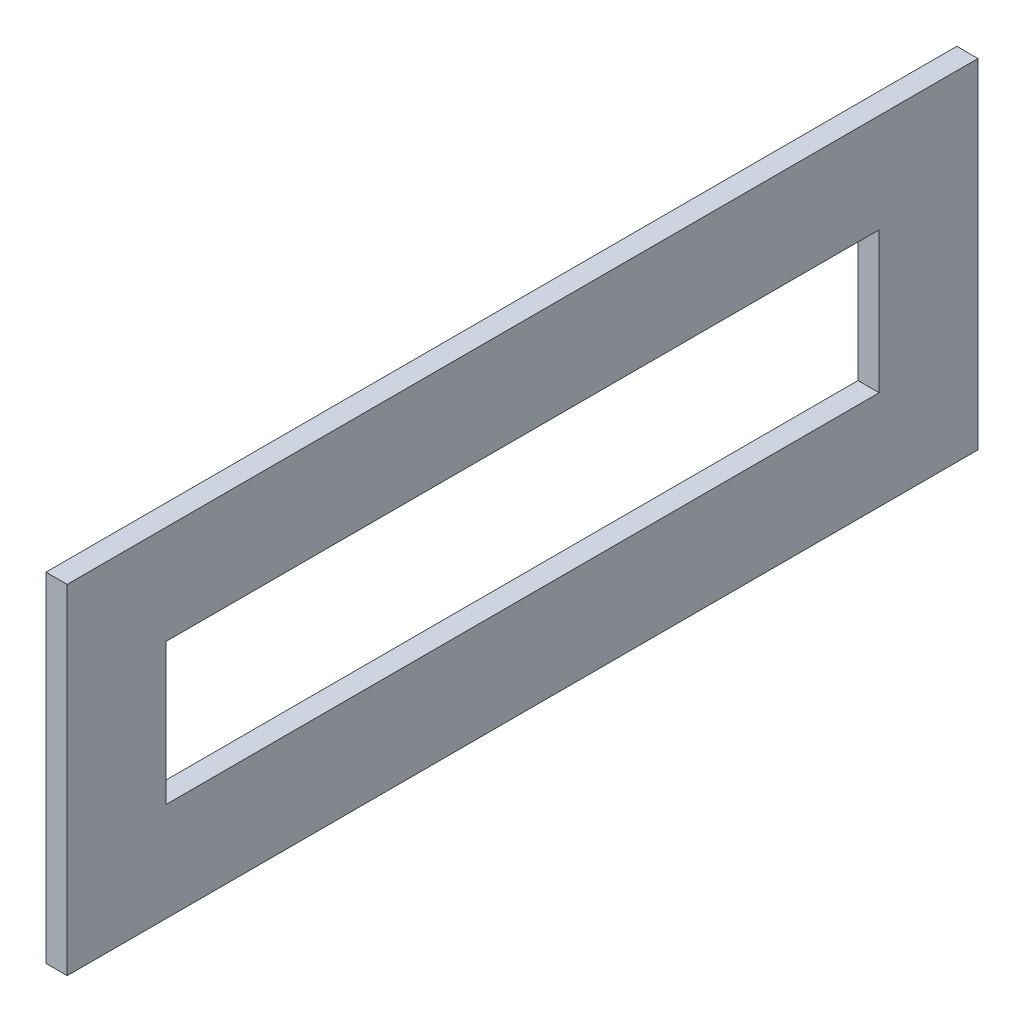
ISO-10303-21;
HEADER;
FILE_DESCRIPTION(('STEP AP214'),'2;1');
FILE_NAME('part.step','',(''),(''),'','','');
FILE_SCHEMA(('AUTOMOTIVE_DESIGN { 1 0 10303 214 1 1 1 1 }'));
ENDSEC;
DATA;
#1=APPLICATION_CONTEXT('core data for automotive mechanical design processes');
#2=APPLICATION_PROTOCOL_DEFINITION('international standard','automotive_design',2000,#1);
#3=PRODUCT_CONTEXT('',#1,'mechanical');
#4=PRODUCT('Part','Part','',(#3));
#5=PRODUCT_RELATED_PRODUCT_CATEGORY('part','',(#4));
#6=PRODUCT_DEFINITION_FORMATION('','',#4);
#7=PRODUCT_DEFINITION_CONTEXT('part definition',#1,'design');
#8=PRODUCT_DEFINITION('design','',#6,#7);
#9=PRODUCT_DEFINITION_SHAPE('','',#8);
#10=(LENGTH_UNIT() NAMED_UNIT(*) SI_UNIT(.MILLI.,.METRE.));
#11=(NAMED_UNIT(*) PLANE_ANGLE_UNIT() SI_UNIT($,.RADIAN.));
#12=(NAMED_UNIT(*) SI_UNIT($,.STERADIAN.) SOLID_ANGLE_UNIT());
#13=UNCERTAINTY_MEASURE_WITH_UNIT(LENGTH_MEASURE(1.E-05),#10,'distance_accuracy_value','');
#14=(GEOMETRIC_REPRESENTATION_CONTEXT(3) GLOBAL_UNCERTAINTY_ASSIGNED_CONTEXT((#13)) GLOBAL_UNIT_ASSIGNED_CONTEXT((#10,
#11,#12)) REPRESENTATION_CONTEXT('',''));
#15=CARTESIAN_POINT('',(0.,0.,0.));
#16=DIRECTION('',(0.,0.,1.));
#17=DIRECTION('',(1.,0.,0.));
#18=AXIS2_PLACEMENT_3D('',#15,#16,#17);
#19=CARTESIAN_POINT('',(3.,0.,0.));
#20=DIRECTION('',(1.,0.,0.));
#21=DIRECTION('',(0.,0.,-1.));
#22=AXIS2_PLACEMENT_3D('',#19,#20,#21);
#23=PLANE('',#22);
#24=DIRECTION('',(0.,1.,0.));
#25=VECTOR('',#24,1.);
#26=CARTESIAN_POINT('',(3.,75.1235294117647,-64.5));
#27=LINE('',#26,#25);
#28=CARTESIAN_POINT('',(3.,27.1235294117647,-64.5));
#29=VERTEX_POINT('',#28);
#30=CARTESIAN_POINT('',(3.,75.1235294117647,-64.5));
#31=VERTEX_POINT('',#30);
#32=EDGE_CURVE('E140',#29,#31,#27,.T.);
#33=ORIENTED_EDGE('',*,*,#32,.T.);
#34=DIRECTION('',(0.,0.,1.));
#35=VECTOR('',#34,1.);
#36=CARTESIAN_POINT('',(3.,75.1235294117647,64.5));
#37=LINE('',#36,#35);
#38=CARTESIAN_POINT('',(3.,75.1235294117647,64.5));
#39=VERTEX_POINT('',#38);
#40=EDGE_CURVE('E143',#31,#39,#37,.T.);
#41=ORIENTED_EDGE('',*,*,#40,.T.);
#42=DIRECTION('',(0.,-1.,0.));
#43=VECTOR('',#42,1.);
#44=CARTESIAN_POINT('',(3.,75.1235294117647,64.5));
#45=LINE('',#44,#43);
#46=CARTESIAN_POINT('',(3.,27.1235294117647,64.5));
#47=VERTEX_POINT('',#46);
#48=EDGE_CURVE('E146',#39,#47,#45,.T.);
#49=ORIENTED_EDGE('',*,*,#48,.T.);
#50=DIRECTION('',(0.,0.,-1.));
#51=VECTOR('',#50,1.);
#52=CARTESIAN_POINT('',(3.,27.1235294117647,64.5));
#53=LINE('',#52,#51);
#54=EDGE_CURVE('E148',#47,#29,#53,.T.);
#55=ORIENTED_EDGE('',*,*,#54,.T.);
#56=EDGE_LOOP('',(#33,#41,#49,#55));
#57=FACE_BOUND('',#56,.T.);
#58=DIRECTION('',(0.,0.,1.));
#59=VECTOR('',#58,1.);
#60=CARTESIAN_POINT('',(3.,61.1235294117647,50.5));
#61=LINE('',#60,#59);
#62=CARTESIAN_POINT('',(3.,61.1235294117647,-50.5));
#63=VERTEX_POINT('',#62);
#64=CARTESIAN_POINT('',(3.,61.1235294117647,50.5));
#65=VERTEX_POINT('',#64);
#66=EDGE_CURVE('E112',#63,#65,#61,.T.);
#67=ORIENTED_EDGE('',*,*,#66,.F.);
#68=DIRECTION('',(0.,1.,0.));
#69=VECTOR('',#68,1.);
#70=CARTESIAN_POINT('',(3.,61.1235294117647,-50.5));
#71=LINE('',#70,#69);
#72=CARTESIAN_POINT('',(3.,41.1235294117647,-50.5));
#73=VERTEX_POINT('',#72);
#74=EDGE_CURVE('E104',#73,#63,#71,.T.);
#75=ORIENTED_EDGE('',*,*,#74,.F.);
#76=DIRECTION('',(0.,0.,-1.));
#77=VECTOR('',#76,1.);
#78=CARTESIAN_POINT('',(3.,41.1235294117647,50.5));
#79=LINE('',#78,#77);
#80=CARTESIAN_POINT('',(3.,41.1235294117647,50.5));
#81=VERTEX_POINT('',#80);
#82=EDGE_CURVE('E126',#81,#73,#79,.T.);
#83=ORIENTED_EDGE('',*,*,#82,.F.);
#84=DIRECTION('',(0.,-1.,0.));
#85=VECTOR('',#84,1.);
#86=CARTESIAN_POINT('',(3.,61.1235294117647,50.5));
#87=LINE('',#86,#85);
#88=EDGE_CURVE('E124',#65,#81,#87,.T.);
#89=ORIENTED_EDGE('',*,*,#88,.F.);
#90=EDGE_LOOP('',(#67,#75,#83,#89));
#91=FACE_BOUND('',#90,.T.);
#92=ADVANCED_FACE('F39',(#57,#91),#23,.T.);
#93=CARTESIAN_POINT('',(0.,0.,0.));
#94=DIRECTION('',(1.,0.,0.));
#95=DIRECTION('',(0.,0.,-1.));
#96=AXIS2_PLACEMENT_3D('',#93,#94,#95);
#97=PLANE('',#96);
#98=DIRECTION('',(0.,1.,0.));
#99=VECTOR('',#98,1.);
#100=CARTESIAN_POINT('',(0.,75.1235294117647,-64.5));
#101=LINE('',#100,#99);
#102=CARTESIAN_POINT('',(0.,27.1235294117647,-64.5));
#103=VERTEX_POINT('',#102);
#104=CARTESIAN_POINT('',(0.,75.1235294117647,-64.5));
#105=VERTEX_POINT('',#104);
#106=EDGE_CURVE('E120',#103,#105,#101,.T.);
#107=ORIENTED_EDGE('',*,*,#106,.F.);
#108=DIRECTION('',(0.,0.,-1.));
#109=VECTOR('',#108,1.);
#110=CARTESIAN_POINT('',(0.,27.1235294117647,64.5));
#111=LINE('',#110,#109);
#112=CARTESIAN_POINT('',(0.,27.1235294117647,64.5));
#113=VERTEX_POINT('',#112);
#114=EDGE_CURVE('E144',#113,#103,#111,.T.);
#115=ORIENTED_EDGE('',*,*,#114,.F.);
#116=DIRECTION('',(0.,-1.,0.));
#117=VECTOR('',#116,1.);
#118=CARTESIAN_POINT('',(0.,75.1235294117647,64.5));
#119=LINE('',#118,#117);
#120=CARTESIAN_POINT('',(0.,75.1235294117647,64.5));
#121=VERTEX_POINT('',#120);
#122=EDGE_CURVE('E155',#121,#113,#119,.T.);
#123=ORIENTED_EDGE('',*,*,#122,.F.);
#124=DIRECTION('',(0.,0.,1.));
#125=VECTOR('',#124,1.);
#126=CARTESIAN_POINT('',(0.,75.1235294117647,64.5));
#127=LINE('',#126,#125);
#128=EDGE_CURVE('E153',#105,#121,#127,.T.);
#129=ORIENTED_EDGE('',*,*,#128,.F.);
#130=EDGE_LOOP('',(#107,#115,#123,#129));
#131=FACE_BOUND('',#130,.T.);
#132=DIRECTION('',(0.,1.,0.));
#133=VECTOR('',#132,1.);
#134=CARTESIAN_POINT('',(0.,61.1235294117647,-50.5));
#135=LINE('',#134,#133);
#136=CARTESIAN_POINT('',(0.,41.1235294117647,-50.5));
#137=VERTEX_POINT('',#136);
#138=CARTESIAN_POINT('',(0.,61.1235294117647,-50.5));
#139=VERTEX_POINT('',#138);
#140=EDGE_CURVE('E62',#137,#139,#135,.T.);
#141=ORIENTED_EDGE('',*,*,#140,.T.);
#142=DIRECTION('',(0.,0.,1.));
#143=VECTOR('',#142,1.);
#144=CARTESIAN_POINT('',(0.,61.1235294117647,50.5));
#145=LINE('',#144,#143);
#146=CARTESIAN_POINT('',(0.,61.1235294117647,50.5));
#147=VERTEX_POINT('',#146);
#148=EDGE_CURVE('E119',#139,#147,#145,.T.);
#149=ORIENTED_EDGE('',*,*,#148,.T.);
#150=DIRECTION('',(0.,-1.,0.));
#151=VECTOR('',#150,1.);
#152=CARTESIAN_POINT('',(0.,61.1235294117647,50.5));
#153=LINE('',#152,#151);
#154=CARTESIAN_POINT('',(0.,41.1235294117647,50.5));
#155=VERTEX_POINT('',#154);
#156=EDGE_CURVE('E132',#147,#155,#153,.T.);
#157=ORIENTED_EDGE('',*,*,#156,.T.);
#158=DIRECTION('',(0.,0.,-1.));
#159=VECTOR('',#158,1.);
#160=CARTESIAN_POINT('',(0.,41.1235294117647,50.5));
#161=LINE('',#160,#159);
#162=EDGE_CURVE('E113',#155,#137,#161,.T.);
#163=ORIENTED_EDGE('',*,*,#162,.T.);
#164=EDGE_LOOP('',(#141,#149,#157,#163));
#165=FACE_BOUND('',#164,.T.);
#166=ADVANCED_FACE('F173',(#131,#165),#97,.F.);
#167=CARTESIAN_POINT('',(3.,75.1235294117647,-64.5));
#168=DIRECTION('',(0.,0.,1.));
#169=DIRECTION('',(1.,0.,0.));
#170=AXIS2_PLACEMENT_3D('',#167,#168,#169);
#171=PLANE('',#170);
#172=ORIENTED_EDGE('',*,*,#106,.T.);
#173=DIRECTION('',(-1.,0.,0.));
#174=VECTOR('',#173,1.);
#175=CARTESIAN_POINT('',(3.,75.1235294117647,-64.5));
#176=LINE('',#175,#174);
#177=EDGE_CURVE('E11',#31,#105,#176,.T.);
#178=ORIENTED_EDGE('',*,*,#177,.F.);
#179=ORIENTED_EDGE('',*,*,#32,.F.);
#180=DIRECTION('',(-1.,0.,0.));
#181=VECTOR('',#180,1.);
#182=CARTESIAN_POINT('',(3.,27.1235294117647,-64.5));
#183=LINE('',#182,#181);
#184=EDGE_CURVE('E150',#29,#103,#183,.T.);
#185=ORIENTED_EDGE('',*,*,#184,.T.);
#186=EDGE_LOOP('',(#172,#178,#179,#185));
#187=FACE_BOUND('',#186,.T.);
#188=ADVANCED_FACE('F41',(#187),#171,.F.);
#189=CARTESIAN_POINT('',(3.,75.1235294117647,64.5));
#190=DIRECTION('',(0.,-1.,0.));
#191=DIRECTION('',(0.,0.,-1.));
#192=AXIS2_PLACEMENT_3D('',#189,#190,#191);
#193=PLANE('',#192);
#194=ORIENTED_EDGE('',*,*,#128,.T.);
#195=DIRECTION('',(-1.,0.,0.));
#196=VECTOR('',#195,1.);
#197=CARTESIAN_POINT('',(3.,75.1235294117647,64.5));
#198=LINE('',#197,#196);
#199=EDGE_CURVE('E47',#39,#121,#198,.T.);
#200=ORIENTED_EDGE('',*,*,#199,.F.);
#201=ORIENTED_EDGE('',*,*,#40,.F.);
#202=ORIENTED_EDGE('',*,*,#177,.T.);
#203=EDGE_LOOP('',(#194,#200,#201,#202));
#204=FACE_BOUND('',#203,.T.);
#205=ADVANCED_FACE('F183',(#204),#193,.F.);
#206=CARTESIAN_POINT('',(3.,75.1235294117647,64.5));
#207=DIRECTION('',(0.,0.,-1.));
#208=DIRECTION('',(0.,1.,0.));
#209=AXIS2_PLACEMENT_3D('',#206,#207,#208);
#210=PLANE('',#209);
#211=ORIENTED_EDGE('',*,*,#122,.T.);
#212=DIRECTION('',(-1.,0.,0.));
#213=VECTOR('',#212,1.);
#214=CARTESIAN_POINT('',(3.,27.1235294117647,64.5));
#215=LINE('',#214,#213);
#216=EDGE_CURVE('E160',#47,#113,#215,.T.);
#217=ORIENTED_EDGE('',*,*,#216,.F.);
#218=ORIENTED_EDGE('',*,*,#48,.F.);
#219=ORIENTED_EDGE('',*,*,#199,.T.);
#220=EDGE_LOOP('',(#211,#217,#218,#219));
#221=FACE_BOUND('',#220,.T.);
#222=ADVANCED_FACE('F167',(#221),#210,.F.);
#223=CARTESIAN_POINT('',(3.,27.1235294117647,64.5));
#224=DIRECTION('',(0.,1.,0.));
#225=DIRECTION('',(0.,0.,1.));
#226=AXIS2_PLACEMENT_3D('',#223,#224,#225);
#227=PLANE('',#226);
#228=ORIENTED_EDGE('',*,*,#114,.T.);
#229=ORIENTED_EDGE('',*,*,#184,.F.);
#230=ORIENTED_EDGE('',*,*,#54,.F.);
#231=ORIENTED_EDGE('',*,*,#216,.T.);
#232=EDGE_LOOP('',(#228,#229,#230,#231));
#233=FACE_BOUND('',#232,.T.);
#234=ADVANCED_FACE('F177',(#233),#227,.F.);
#235=CARTESIAN_POINT('',(3.,61.1235294117647,-50.5));
#236=DIRECTION('',(0.,0.,1.));
#237=DIRECTION('',(1.,0.,0.));
#238=AXIS2_PLACEMENT_3D('',#235,#236,#237);
#239=PLANE('',#238);
#240=ORIENTED_EDGE('',*,*,#140,.F.);
#241=DIRECTION('',(-1.,0.,0.));
#242=VECTOR('',#241,1.);
#243=CARTESIAN_POINT('',(3.,41.1235294117647,-50.5));
#244=LINE('',#243,#242);
#245=EDGE_CURVE('E108',#73,#137,#244,.T.);
#246=ORIENTED_EDGE('',*,*,#245,.F.);
#247=ORIENTED_EDGE('',*,*,#74,.T.);
#248=DIRECTION('',(-1.,0.,0.));
#249=VECTOR('',#248,1.);
#250=CARTESIAN_POINT('',(3.,61.1235294117647,-50.5));
#251=LINE('',#250,#249);
#252=EDGE_CURVE('E107',#63,#139,#251,.T.);
#253=ORIENTED_EDGE('',*,*,#252,.T.);
#254=EDGE_LOOP('',(#240,#246,#247,#253));
#255=FACE_BOUND('',#254,.T.);
#256=ADVANCED_FACE('F106',(#255),#239,.T.);
#257=CARTESIAN_POINT('',(3.,61.1235294117647,50.5));
#258=DIRECTION('',(0.,-1.,0.));
#259=DIRECTION('',(0.,0.,-1.));
#260=AXIS2_PLACEMENT_3D('',#257,#258,#259);
#261=PLANE('',#260);
#262=ORIENTED_EDGE('',*,*,#148,.F.);
#263=ORIENTED_EDGE('',*,*,#252,.F.);
#264=ORIENTED_EDGE('',*,*,#66,.T.);
#265=DIRECTION('',(-1.,0.,0.));
#266=VECTOR('',#265,1.);
#267=CARTESIAN_POINT('',(3.,61.1235294117647,50.5));
#268=LINE('',#267,#266);
#269=EDGE_CURVE('E121',#65,#147,#268,.T.);
#270=ORIENTED_EDGE('',*,*,#269,.T.);
#271=EDGE_LOOP('',(#262,#263,#264,#270));
#272=FACE_BOUND('',#271,.T.);
#273=ADVANCED_FACE('F116',(#272),#261,.T.);
#274=CARTESIAN_POINT('',(3.,61.1235294117647,50.5));
#275=DIRECTION('',(0.,0.,-1.));
#276=DIRECTION('',(0.,1.,0.));
#277=AXIS2_PLACEMENT_3D('',#274,#275,#276);
#278=PLANE('',#277);
#279=ORIENTED_EDGE('',*,*,#156,.F.);
#280=ORIENTED_EDGE('',*,*,#269,.F.);
#281=ORIENTED_EDGE('',*,*,#88,.T.);
#282=DIRECTION('',(-1.,0.,0.));
#283=VECTOR('',#282,1.);
#284=CARTESIAN_POINT('',(3.,41.1235294117647,50.5));
#285=LINE('',#284,#283);
#286=EDGE_CURVE('E54',#81,#155,#285,.T.);
#287=ORIENTED_EDGE('',*,*,#286,.T.);
#288=EDGE_LOOP('',(#279,#280,#281,#287));
#289=FACE_BOUND('',#288,.T.);
#290=ADVANCED_FACE('F206',(#289),#278,.T.);
#291=CARTESIAN_POINT('',(3.,41.1235294117647,50.5));
#292=DIRECTION('',(0.,1.,0.));
#293=DIRECTION('',(0.,0.,1.));
#294=AXIS2_PLACEMENT_3D('',#291,#292,#293);
#295=PLANE('',#294);
#296=ORIENTED_EDGE('',*,*,#162,.F.);
#297=ORIENTED_EDGE('',*,*,#286,.F.);
#298=ORIENTED_EDGE('',*,*,#82,.T.);
#299=ORIENTED_EDGE('',*,*,#245,.T.);
#300=EDGE_LOOP('',(#296,#297,#298,#299));
#301=FACE_BOUND('',#300,.T.);
#302=ADVANCED_FACE('F210',(#301),#295,.T.);
#303=CLOSED_SHELL('',(#92,#166,#188,#205,#222,#234,#256,#273,#290,#302));
#304=MANIFOLD_SOLID_BREP('B2',#303);
#305=ADVANCED_BREP_SHAPE_REPRESENTATION('',(#18,#304),#14);
#306=SHAPE_DEFINITION_REPRESENTATION(#9,#305);
ENDSEC;
END-ISO-10303-21;
